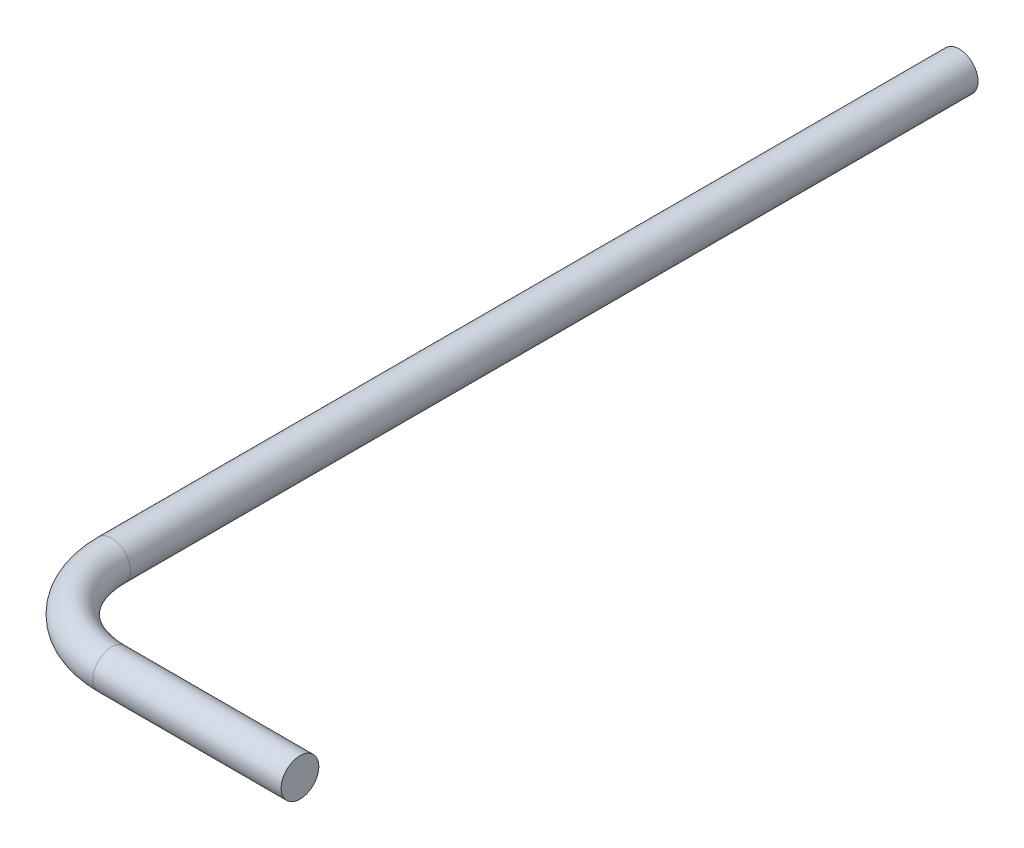
ISO-10303-21;
HEADER;
FILE_DESCRIPTION(('STEP AP214'),'2;1');
FILE_NAME('part.step','',(''),(''),'','','');
FILE_SCHEMA(('AUTOMOTIVE_DESIGN { 1 0 10303 214 1 1 1 1 }'));
ENDSEC;
DATA;
#1=APPLICATION_CONTEXT('core data for automotive mechanical design processes');
#2=APPLICATION_PROTOCOL_DEFINITION('international standard','automotive_design',2000,#1);
#3=PRODUCT_CONTEXT('',#1,'mechanical');
#4=PRODUCT('Part','Part','',(#3));
#5=PRODUCT_RELATED_PRODUCT_CATEGORY('part','',(#4));
#6=PRODUCT_DEFINITION_FORMATION('','',#4);
#7=PRODUCT_DEFINITION_CONTEXT('part definition',#1,'design');
#8=PRODUCT_DEFINITION('design','',#6,#7);
#9=PRODUCT_DEFINITION_SHAPE('','',#8);
#10=(LENGTH_UNIT() NAMED_UNIT(*) SI_UNIT(.MILLI.,.METRE.));
#11=(NAMED_UNIT(*) PLANE_ANGLE_UNIT() SI_UNIT($,.RADIAN.));
#12=(NAMED_UNIT(*) SI_UNIT($,.STERADIAN.) SOLID_ANGLE_UNIT());
#13=UNCERTAINTY_MEASURE_WITH_UNIT(LENGTH_MEASURE(1.E-05),#10,'distance_accuracy_value','');
#14=(GEOMETRIC_REPRESENTATION_CONTEXT(3) GLOBAL_UNCERTAINTY_ASSIGNED_CONTEXT((#13)) GLOBAL_UNIT_ASSIGNED_CONTEXT((#10,
#11,#12)) REPRESENTATION_CONTEXT('',''));
#15=CARTESIAN_POINT('',(0.,0.,0.));
#16=DIRECTION('',(0.,0.,1.));
#17=DIRECTION('',(1.,0.,0.));
#18=AXIS2_PLACEMENT_3D('',#15,#16,#17);
#19=CARTESIAN_POINT('',(0.,0.,0.));
#20=DIRECTION('',(1.,0.,0.));
#21=DIRECTION('',(0.,0.,-1.));
#22=AXIS2_PLACEMENT_3D('',#19,#20,#21);
#23=PLANE('',#22);
#24=CARTESIAN_POINT('',(0.,0.,0.));
#25=DIRECTION('',(1.,0.,0.));
#26=DIRECTION('',(0.,0.,-1.));
#27=AXIS2_PLACEMENT_3D('',#24,#25,#26);
#28=CIRCLE('',#27,2.);
#29=CARTESIAN_POINT('',(0.,0.,-2.));
#30=VERTEX_POINT('',#29);
#31=EDGE_CURVE('E72',#30,#30,#28,.T.);
#32=ORIENTED_EDGE('',*,*,#31,.T.);
#33=EDGE_LOOP('',(#32));
#34=FACE_BOUND('',#33,.T.);
#35=ADVANCED_FACE('F55',(#34),#23,.T.);
#36=CARTESIAN_POINT('',(-30.,0.,-100.));
#37=DIRECTION('',(0.,0.,1.));
#38=DIRECTION('',(1.,0.,0.));
#39=AXIS2_PLACEMENT_3D('',#36,#37,#38);
#40=PLANE('',#39);
#41=CARTESIAN_POINT('',(-30.,0.,-100.));
#42=DIRECTION('',(0.,0.,1.));
#43=DIRECTION('',(1.,0.,0.));
#44=AXIS2_PLACEMENT_3D('',#41,#42,#43);
#45=CIRCLE('',#44,2.);
#46=CARTESIAN_POINT('',(-32.,0.,-100.));
#47=VERTEX_POINT('',#46);
#48=EDGE_CURVE('E11',#47,#47,#45,.T.);
#49=ORIENTED_EDGE('',*,*,#48,.F.);
#50=EDGE_LOOP('',(#49));
#51=FACE_BOUND('',#50,.T.);
#52=ADVANCED_FACE('F83',(#51),#40,.F.);
#53=CARTESIAN_POINT('',(0.,0.,0.));
#54=DIRECTION('',(-1.,0.,0.));
#55=DIRECTION('',(0.,0.,1.));
#56=AXIS2_PLACEMENT_3D('',#53,#54,#55);
#57=CYLINDRICAL_SURFACE('',#56,2.);
#58=CARTESIAN_POINT('',(-20.,0.,0.));
#59=DIRECTION('',(1.,0.,0.));
#60=DIRECTION('',(0.,0.,-1.));
#61=AXIS2_PLACEMENT_3D('',#58,#59,#60);
#62=CIRCLE('',#61,2.);
#63=CARTESIAN_POINT('',(-20.,0.,2.00000000000001));
#64=VERTEX_POINT('',#63);
#65=EDGE_CURVE('E67',#64,#64,#62,.T.);
#66=ORIENTED_EDGE('',*,*,#65,.T.);
#67=EDGE_LOOP('',(#66));
#68=FACE_BOUND('',#67,.T.);
#69=ORIENTED_EDGE('',*,*,#31,.F.);
#70=EDGE_LOOP('',(#69));
#71=FACE_BOUND('',#70,.T.);
#72=ADVANCED_FACE('F80',(#68,#71),#57,.T.);
#73=CARTESIAN_POINT('',(-20.,0.,-10.));
#74=DIRECTION('',(0.,-1.,0.));
#75=DIRECTION('',(0.,0.,-1.));
#76=AXIS2_PLACEMENT_3D('',#73,#74,#75);
#77=TOROIDAL_SURFACE('',#76,10.,2.);
#78=CARTESIAN_POINT('',(-30.,0.,-9.99999999999999));
#79=DIRECTION('',(0.,0.,1.));
#80=DIRECTION('',(1.,0.,0.));
#81=AXIS2_PLACEMENT_3D('',#78,#79,#80);
#82=CIRCLE('',#81,2.);
#83=CARTESIAN_POINT('',(-32.,0.,-9.99999999999999));
#84=VERTEX_POINT('',#83);
#85=EDGE_CURVE('E62',#84,#84,#82,.T.);
#86=CARTESIAN_POINT('',(-20.,0.,-10.));
#87=DIRECTION('',(0.,-1.,0.));
#88=DIRECTION('',(0.,0.,-1.));
#89=AXIS2_PLACEMENT_3D('',#86,#87,#88);
#90=CIRCLE('',#89,12.);
#91=EDGE_CURVE('',#64,#84,#90,.T.);
#92=ORIENTED_EDGE('',*,*,#65,.F.);
#93=ORIENTED_EDGE('',*,*,#85,.T.);
#94=ORIENTED_EDGE('',*,*,#91,.T.);
#95=ORIENTED_EDGE('',*,*,#91,.F.);
#96=EDGE_LOOP('',(#92,#94,#93,#95));
#97=FACE_BOUND('',#96,.T.);
#98=ADVANCED_FACE('F82',(#97),#77,.T.);
#99=CARTESIAN_POINT('',(-30.,0.,-9.99999999999999));
#100=DIRECTION('',(0.,0.,-1.));
#101=DIRECTION('',(-1.,0.,0.));
#102=AXIS2_PLACEMENT_3D('',#99,#100,#101);
#103=CYLINDRICAL_SURFACE('',#102,2.);
#104=CARTESIAN_POINT('',(-32.,0.,-100.));
#105=CARTESIAN_POINT('',(-32.,0.,-99.0625));
#106=CARTESIAN_POINT('',(-32.,0.,-98.125));
#107=CARTESIAN_POINT('',(-32.,0.,-96.25));
#108=CARTESIAN_POINT('',(-32.,0.,-95.3125));
#109=CARTESIAN_POINT('',(-32.,0.,-93.4375));
#110=CARTESIAN_POINT('',(-32.,0.,-92.5));
#111=CARTESIAN_POINT('',(-32.,0.,-90.625));
#112=CARTESIAN_POINT('',(-32.,0.,-89.6875));
#113=CARTESIAN_POINT('',(-32.,0.,-87.8125));
#114=CARTESIAN_POINT('',(-32.,0.,-86.875));
#115=CARTESIAN_POINT('',(-32.,0.,-85.));
#116=CARTESIAN_POINT('',(-32.,0.,-84.0625));
#117=CARTESIAN_POINT('',(-32.,0.,-82.1875));
#118=CARTESIAN_POINT('',(-32.,0.,-81.25));
#119=CARTESIAN_POINT('',(-32.,0.,-79.375));
#120=CARTESIAN_POINT('',(-32.,0.,-78.4375));
#121=CARTESIAN_POINT('',(-32.,0.,-76.5625));
#122=CARTESIAN_POINT('',(-32.,0.,-75.625));
#123=CARTESIAN_POINT('',(-32.,0.,-73.75));
#124=CARTESIAN_POINT('',(-32.,0.,-72.8125));
#125=CARTESIAN_POINT('',(-32.,0.,-70.9375));
#126=CARTESIAN_POINT('',(-32.,0.,-70.));
#127=CARTESIAN_POINT('',(-32.,0.,-68.125));
#128=CARTESIAN_POINT('',(-32.,0.,-67.1875));
#129=CARTESIAN_POINT('',(-32.,0.,-65.3125));
#130=CARTESIAN_POINT('',(-32.,0.,-64.375));
#131=CARTESIAN_POINT('',(-32.,0.,-62.5));
#132=CARTESIAN_POINT('',(-32.,0.,-61.5625));
#133=CARTESIAN_POINT('',(-32.,0.,-59.6875));
#134=CARTESIAN_POINT('',(-32.,0.,-58.75));
#135=CARTESIAN_POINT('',(-32.,0.,-56.875));
#136=CARTESIAN_POINT('',(-32.,0.,-55.9375));
#137=CARTESIAN_POINT('',(-32.,0.,-54.0625));
#138=CARTESIAN_POINT('',(-32.,0.,-53.125));
#139=CARTESIAN_POINT('',(-32.,0.,-51.25));
#140=CARTESIAN_POINT('',(-32.,0.,-50.3125));
#141=CARTESIAN_POINT('',(-32.,0.,-48.4375));
#142=CARTESIAN_POINT('',(-32.,0.,-47.5));
#143=CARTESIAN_POINT('',(-32.,0.,-45.625));
#144=CARTESIAN_POINT('',(-32.,0.,-44.6875));
#145=CARTESIAN_POINT('',(-32.,0.,-42.8125));
#146=CARTESIAN_POINT('',(-32.,0.,-41.875));
#147=CARTESIAN_POINT('',(-32.,0.,-40.));
#148=CARTESIAN_POINT('',(-32.,0.,-39.0625));
#149=CARTESIAN_POINT('',(-32.,0.,-37.1875));
#150=CARTESIAN_POINT('',(-32.,0.,-36.25));
#151=CARTESIAN_POINT('',(-32.,0.,-34.375));
#152=CARTESIAN_POINT('',(-32.,0.,-33.4375));
#153=CARTESIAN_POINT('',(-32.,0.,-31.5625));
#154=CARTESIAN_POINT('',(-32.,0.,-30.625));
#155=CARTESIAN_POINT('',(-32.,0.,-28.75));
#156=CARTESIAN_POINT('',(-32.,0.,-27.8125));
#157=CARTESIAN_POINT('',(-32.,0.,-25.9375));
#158=CARTESIAN_POINT('',(-32.,0.,-25.));
#159=CARTESIAN_POINT('',(-32.,0.,-23.125));
#160=CARTESIAN_POINT('',(-32.,0.,-22.1875));
#161=CARTESIAN_POINT('',(-32.,0.,-20.3125));
#162=CARTESIAN_POINT('',(-32.,0.,-19.375));
#163=CARTESIAN_POINT('',(-32.,0.,-17.5));
#164=CARTESIAN_POINT('',(-32.,0.,-16.5625));
#165=CARTESIAN_POINT('',(-32.,0.,-14.6875));
#166=CARTESIAN_POINT('',(-32.,0.,-13.75));
#167=CARTESIAN_POINT('',(-32.,0.,-11.875));
#168=CARTESIAN_POINT('',(-32.,0.,-10.9375));
#169=CARTESIAN_POINT('',(-32.,0.,-9.99999999999999));
#170=B_SPLINE_CURVE_WITH_KNOTS('',3,(#104,#105,#106,#107,#108,#109,#110,#111,#112,#113,#114,
#115,#116,#117,#118,#119,#120,#121,#122,#123,#124,#125,#126,#127,#128,#129,#130,#131,#132,#133,
#134,#135,#136,#137,#138,#139,#140,#141,#142,#143,#144,#145,#146,#147,#148,#149,#150,#151,#152,
#153,#154,#155,#156,#157,#158,#159,#160,#161,#162,#163,#164,#165,#166,#167,#168,#169),
.UNSPECIFIED.,.F.,.F.,(4,2,2,2,2,2,2,2,2,2,2,2,2,2,2,2,2,2,2,2,2,2,2,2,2,2,2,2,2,2,2,2,4),(0.,
2.8125,5.62500000000001,8.4375,11.25,14.0625,16.875,19.6875,22.5,25.3125,28.125,30.9375,33.75,
36.5625,39.375,42.1875,45.,47.8125,50.625,53.4375,56.25,59.0625,61.875,64.6875,67.5,70.3125,
73.125,75.9375,78.75,81.5625,84.375,87.1875,90.),.UNSPECIFIED.);
#171=EDGE_CURVE('BSEAM90',#47,#84,#170,.T.);
#172=ORIENTED_EDGE('',*,*,#48,.T.);
#173=ORIENTED_EDGE('',*,*,#85,.F.);
#174=ORIENTED_EDGE('',*,*,#171,.T.);
#175=ORIENTED_EDGE('',*,*,#171,.F.);
#176=EDGE_LOOP('',(#172,#174,#173,#175));
#177=FACE_BOUND('',#176,.T.);
#178=ADVANCED_FACE('F90',(#177),#103,.T.);
#179=CLOSED_SHELL('',(#35,#52,#72,#98,#178));
#180=MANIFOLD_SOLID_BREP('B2',#179);
#181=ADVANCED_BREP_SHAPE_REPRESENTATION('',(#18,#180),#14);
#182=SHAPE_DEFINITION_REPRESENTATION(#9,#181);
ENDSEC;
END-ISO-10303-21;
